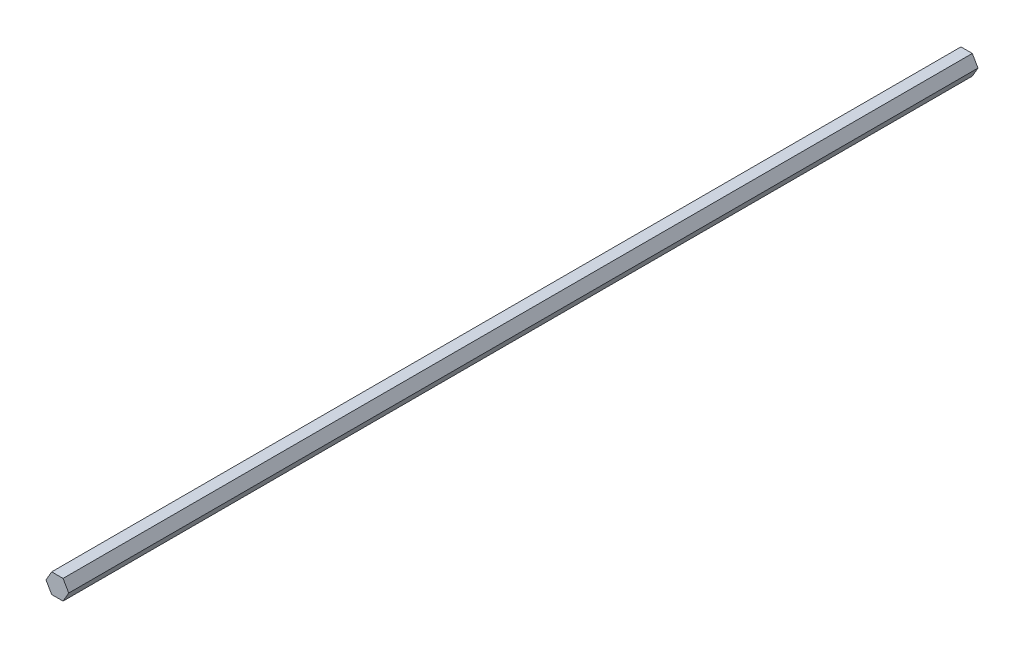
ISO-10303-21;
HEADER;
FILE_DESCRIPTION(('STEP AP214'),'2;1');
FILE_NAME('part.step','',(''),(''),'','','');
FILE_SCHEMA(('AUTOMOTIVE_DESIGN { 1 0 10303 214 1 1 1 1 }'));
ENDSEC;
DATA;
#1=APPLICATION_CONTEXT('core data for automotive mechanical design processes');
#2=APPLICATION_PROTOCOL_DEFINITION('international standard','automotive_design',2000,#1);
#3=PRODUCT_CONTEXT('',#1,'mechanical');
#4=PRODUCT('Part','Part','',(#3));
#5=PRODUCT_RELATED_PRODUCT_CATEGORY('part','',(#4));
#6=PRODUCT_DEFINITION_FORMATION('','',#4);
#7=PRODUCT_DEFINITION_CONTEXT('part definition',#1,'design');
#8=PRODUCT_DEFINITION('design','',#6,#7);
#9=PRODUCT_DEFINITION_SHAPE('','',#8);
#10=(LENGTH_UNIT() NAMED_UNIT(*) SI_UNIT(.MILLI.,.METRE.));
#11=(NAMED_UNIT(*) PLANE_ANGLE_UNIT() SI_UNIT($,.RADIAN.));
#12=(NAMED_UNIT(*) SI_UNIT($,.STERADIAN.) SOLID_ANGLE_UNIT());
#13=UNCERTAINTY_MEASURE_WITH_UNIT(LENGTH_MEASURE(1.E-05),#10,'distance_accuracy_value','');
#14=(GEOMETRIC_REPRESENTATION_CONTEXT(3) GLOBAL_UNCERTAINTY_ASSIGNED_CONTEXT((#13)) GLOBAL_UNIT_ASSIGNED_CONTEXT((#10,
#11,#12)) REPRESENTATION_CONTEXT('',''));
#15=CARTESIAN_POINT('',(0.,0.,0.));
#16=DIRECTION('',(0.,0.,1.));
#17=DIRECTION('',(1.,0.,0.));
#18=AXIS2_PLACEMENT_3D('',#15,#16,#17);
#19=CARTESIAN_POINT('',(3.65125,-6.32415051113586,292.1));
#20=DIRECTION('',(-0.866025403784439,0.5,0.));
#21=DIRECTION('',(-0.5,-0.866025403784439,0.));
#22=AXIS2_PLACEMENT_3D('',#19,#20,#21);
#23=PLANE('',#22);
#24=DIRECTION('',(0.5,0.866025403784439,0.));
#25=VECTOR('',#24,1.);
#26=CARTESIAN_POINT('',(3.65125,-6.32415051113586,-292.1));
#27=LINE('',#26,#25);
#28=CARTESIAN_POINT('',(3.65125,-6.32415051113586,-292.1));
#29=VERTEX_POINT('',#28);
#30=CARTESIAN_POINT('',(7.3025,0.,-292.1));
#31=VERTEX_POINT('',#30);
#32=EDGE_CURVE('E116',#29,#31,#27,.T.);
#33=ORIENTED_EDGE('',*,*,#32,.T.);
#34=DIRECTION('',(0.,0.,-1.));
#35=VECTOR('',#34,1.);
#36=CARTESIAN_POINT('',(7.3025,0.,292.1));
#37=LINE('',#36,#35);
#38=CARTESIAN_POINT('',(7.3025,0.,292.1));
#39=VERTEX_POINT('',#38);
#40=EDGE_CURVE('E11',#39,#31,#37,.T.);
#41=ORIENTED_EDGE('',*,*,#40,.F.);
#42=DIRECTION('',(0.5,0.866025403784439,0.));
#43=VECTOR('',#42,1.);
#44=CARTESIAN_POINT('',(3.65125,-6.32415051113586,292.1));
#45=LINE('',#44,#43);
#46=CARTESIAN_POINT('',(3.65125,-6.32415051113586,292.1));
#47=VERTEX_POINT('',#46);
#48=EDGE_CURVE('E126',#47,#39,#45,.T.);
#49=ORIENTED_EDGE('',*,*,#48,.F.);
#50=DIRECTION('',(0.,0.,-1.));
#51=VECTOR('',#50,1.);
#52=CARTESIAN_POINT('',(3.65125,-6.32415051113586,292.1));
#53=LINE('',#52,#51);
#54=EDGE_CURVE('E112',#47,#29,#53,.T.);
#55=ORIENTED_EDGE('',*,*,#54,.T.);
#56=EDGE_LOOP('',(#33,#41,#49,#55));
#57=FACE_BOUND('',#56,.T.);
#58=ADVANCED_FACE('F32',(#57),#23,.F.);
#59=CARTESIAN_POINT('',(7.3025,0.,292.1));
#60=DIRECTION('',(-0.866025403784439,-0.5,0.));
#61=DIRECTION('',(0.5,-0.866025403784439,0.));
#62=AXIS2_PLACEMENT_3D('',#59,#60,#61);
#63=PLANE('',#62);
#64=DIRECTION('',(-0.5,0.866025403784439,0.));
#65=VECTOR('',#64,1.);
#66=CARTESIAN_POINT('',(7.3025,0.,-292.1));
#67=LINE('',#66,#65);
#68=CARTESIAN_POINT('',(3.65125,6.32415051113586,-292.1));
#69=VERTEX_POINT('',#68);
#70=EDGE_CURVE('E119',#31,#69,#67,.T.);
#71=ORIENTED_EDGE('',*,*,#70,.T.);
#72=DIRECTION('',(0.,0.,-1.));
#73=VECTOR('',#72,1.);
#74=CARTESIAN_POINT('',(3.65125,6.32415051113586,292.1));
#75=LINE('',#74,#73);
#76=CARTESIAN_POINT('',(3.65125,6.32415051113586,292.1));
#77=VERTEX_POINT('',#76);
#78=EDGE_CURVE('E40',#77,#69,#75,.T.);
#79=ORIENTED_EDGE('',*,*,#78,.F.);
#80=DIRECTION('',(-0.5,0.866025403784439,0.));
#81=VECTOR('',#80,1.);
#82=CARTESIAN_POINT('',(7.3025,0.,292.1));
#83=LINE('',#82,#81);
#84=EDGE_CURVE('E85',#39,#77,#83,.T.);
#85=ORIENTED_EDGE('',*,*,#84,.F.);
#86=ORIENTED_EDGE('',*,*,#40,.T.);
#87=EDGE_LOOP('',(#71,#79,#85,#86));
#88=FACE_BOUND('',#87,.T.);
#89=ADVANCED_FACE('F150',(#88),#63,.F.);
#90=CARTESIAN_POINT('',(3.65125,6.32415051113586,292.1));
#91=DIRECTION('',(0.,-1.,0.));
#92=DIRECTION('',(0.,0.,-1.));
#93=AXIS2_PLACEMENT_3D('',#90,#91,#92);
#94=PLANE('',#93);
#95=DIRECTION('',(-1.,0.,0.));
#96=VECTOR('',#95,1.);
#97=CARTESIAN_POINT('',(3.65125,6.32415051113586,-292.1));
#98=LINE('',#97,#96);
#99=CARTESIAN_POINT('',(-3.65125,6.32415051113586,-292.1));
#100=VERTEX_POINT('',#99);
#101=EDGE_CURVE('E121',#69,#100,#98,.T.);
#102=ORIENTED_EDGE('',*,*,#101,.T.);
#103=DIRECTION('',(0.,0.,-1.));
#104=VECTOR('',#103,1.);
#105=CARTESIAN_POINT('',(-3.65125,6.32415051113586,292.1));
#106=LINE('',#105,#104);
#107=CARTESIAN_POINT('',(-3.65125,6.32415051113586,292.1));
#108=VERTEX_POINT('',#107);
#109=EDGE_CURVE('E107',#108,#100,#106,.T.);
#110=ORIENTED_EDGE('',*,*,#109,.F.);
#111=DIRECTION('',(-1.,0.,0.));
#112=VECTOR('',#111,1.);
#113=CARTESIAN_POINT('',(3.65125,6.32415051113586,292.1));
#114=LINE('',#113,#112);
#115=EDGE_CURVE('E98',#77,#108,#114,.T.);
#116=ORIENTED_EDGE('',*,*,#115,.F.);
#117=ORIENTED_EDGE('',*,*,#78,.T.);
#118=EDGE_LOOP('',(#102,#110,#116,#117));
#119=FACE_BOUND('',#118,.T.);
#120=ADVANCED_FACE('F132',(#119),#94,.F.);
#121=CARTESIAN_POINT('',(-3.65125,6.32415051113586,292.1));
#122=DIRECTION('',(0.866025403784439,-0.5,0.));
#123=DIRECTION('',(0.5,0.866025403784439,0.));
#124=AXIS2_PLACEMENT_3D('',#121,#122,#123);
#125=PLANE('',#124);
#126=DIRECTION('',(-0.5,-0.866025403784439,0.));
#127=VECTOR('',#126,1.);
#128=CARTESIAN_POINT('',(-3.65125,6.32415051113586,-292.1));
#129=LINE('',#128,#127);
#130=CARTESIAN_POINT('',(-7.3025,0.,-292.1));
#131=VERTEX_POINT('',#130);
#132=EDGE_CURVE('E106',#100,#131,#129,.T.);
#133=ORIENTED_EDGE('',*,*,#132,.T.);
#134=DIRECTION('',(0.,0.,-1.));
#135=VECTOR('',#134,1.);
#136=CARTESIAN_POINT('',(-7.3025,0.,292.1));
#137=LINE('',#136,#135);
#138=CARTESIAN_POINT('',(-7.3025,0.,292.1));
#139=VERTEX_POINT('',#138);
#140=EDGE_CURVE('E103',#139,#131,#137,.T.);
#141=ORIENTED_EDGE('',*,*,#140,.F.);
#142=DIRECTION('',(-0.5,-0.866025403784439,0.));
#143=VECTOR('',#142,1.);
#144=CARTESIAN_POINT('',(-3.65125,6.32415051113586,292.1));
#145=LINE('',#144,#143);
#146=EDGE_CURVE('E92',#108,#139,#145,.T.);
#147=ORIENTED_EDGE('',*,*,#146,.F.);
#148=ORIENTED_EDGE('',*,*,#109,.T.);
#149=EDGE_LOOP('',(#133,#141,#147,#148));
#150=FACE_BOUND('',#149,.T.);
#151=ADVANCED_FACE('F104',(#150),#125,.F.);
#152=CARTESIAN_POINT('',(-7.3025,0.,292.1));
#153=DIRECTION('',(0.866025403784439,0.5,0.));
#154=DIRECTION('',(-0.5,0.866025403784439,0.));
#155=AXIS2_PLACEMENT_3D('',#152,#153,#154);
#156=PLANE('',#155);
#157=DIRECTION('',(0.5,-0.866025403784439,0.));
#158=VECTOR('',#157,1.);
#159=CARTESIAN_POINT('',(-7.3025,0.,-292.1));
#160=LINE('',#159,#158);
#161=CARTESIAN_POINT('',(-3.65125,-6.32415051113586,-292.1));
#162=VERTEX_POINT('',#161);
#163=EDGE_CURVE('E71',#131,#162,#160,.T.);
#164=ORIENTED_EDGE('',*,*,#163,.T.);
#165=DIRECTION('',(0.,0.,-1.));
#166=VECTOR('',#165,1.);
#167=CARTESIAN_POINT('',(-3.65125,-6.32415051113586,292.1));
#168=LINE('',#167,#166);
#169=CARTESIAN_POINT('',(-3.65125,-6.32415051113586,292.1));
#170=VERTEX_POINT('',#169);
#171=EDGE_CURVE('E108',#170,#162,#168,.T.);
#172=ORIENTED_EDGE('',*,*,#171,.F.);
#173=DIRECTION('',(0.5,-0.866025403784439,0.));
#174=VECTOR('',#173,1.);
#175=CARTESIAN_POINT('',(-7.3025,0.,292.1));
#176=LINE('',#175,#174);
#177=EDGE_CURVE('E96',#139,#170,#176,.T.);
#178=ORIENTED_EDGE('',*,*,#177,.F.);
#179=ORIENTED_EDGE('',*,*,#140,.T.);
#180=EDGE_LOOP('',(#164,#172,#178,#179));
#181=FACE_BOUND('',#180,.T.);
#182=ADVANCED_FACE('F110',(#181),#156,.F.);
#183=CARTESIAN_POINT('',(-3.65125,-6.32415051113586,292.1));
#184=DIRECTION('',(0.,1.,0.));
#185=DIRECTION('',(-1.,0.,0.));
#186=AXIS2_PLACEMENT_3D('',#183,#184,#185);
#187=PLANE('',#186);
#188=DIRECTION('',(1.,0.,0.));
#189=VECTOR('',#188,1.);
#190=CARTESIAN_POINT('',(-3.65125,-6.32415051113586,-292.1));
#191=LINE('',#190,#189);
#192=EDGE_CURVE('E77',#162,#29,#191,.T.);
#193=ORIENTED_EDGE('',*,*,#192,.T.);
#194=ORIENTED_EDGE('',*,*,#54,.F.);
#195=DIRECTION('',(1.,0.,0.));
#196=VECTOR('',#195,1.);
#197=CARTESIAN_POINT('',(-3.65125,-6.32415051113586,292.1));
#198=LINE('',#197,#196);
#199=EDGE_CURVE('E48',#170,#47,#198,.T.);
#200=ORIENTED_EDGE('',*,*,#199,.F.);
#201=ORIENTED_EDGE('',*,*,#171,.T.);
#202=EDGE_LOOP('',(#193,#194,#200,#201));
#203=FACE_BOUND('',#202,.T.);
#204=ADVANCED_FACE('F139',(#203),#187,.F.);
#205=CARTESIAN_POINT('',(0.,0.,292.1));
#206=DIRECTION('',(0.,0.,1.));
#207=DIRECTION('',(1.,0.,0.));
#208=AXIS2_PLACEMENT_3D('',#205,#206,#207);
#209=PLANE('',#208);
#210=ORIENTED_EDGE('',*,*,#48,.T.);
#211=ORIENTED_EDGE('',*,*,#84,.T.);
#212=ORIENTED_EDGE('',*,*,#115,.T.);
#213=ORIENTED_EDGE('',*,*,#146,.T.);
#214=ORIENTED_EDGE('',*,*,#177,.T.);
#215=ORIENTED_EDGE('',*,*,#199,.T.);
#216=EDGE_LOOP('',(#210,#211,#212,#213,#214,#215));
#217=FACE_BOUND('',#216,.T.);
#218=ADVANCED_FACE('F94',(#217),#209,.T.);
#219=CARTESIAN_POINT('',(0.,0.,-292.1));
#220=DIRECTION('',(0.,0.,1.));
#221=DIRECTION('',(1.,0.,0.));
#222=AXIS2_PLACEMENT_3D('',#219,#220,#221);
#223=PLANE('',#222);
#224=ORIENTED_EDGE('',*,*,#32,.F.);
#225=ORIENTED_EDGE('',*,*,#192,.F.);
#226=ORIENTED_EDGE('',*,*,#163,.F.);
#227=ORIENTED_EDGE('',*,*,#132,.F.);
#228=ORIENTED_EDGE('',*,*,#101,.F.);
#229=ORIENTED_EDGE('',*,*,#70,.F.);
#230=EDGE_LOOP('',(#224,#225,#226,#227,#228,#229));
#231=FACE_BOUND('',#230,.T.);
#232=ADVANCED_FACE('F135',(#231),#223,.F.);
#233=CLOSED_SHELL('',(#58,#89,#120,#151,#182,#204,#218,#232));
#234=MANIFOLD_SOLID_BREP('B2',#233);
#235=ADVANCED_BREP_SHAPE_REPRESENTATION('',(#18,#234),#14);
#236=SHAPE_DEFINITION_REPRESENTATION(#9,#235);
ENDSEC;
END-ISO-10303-21;
